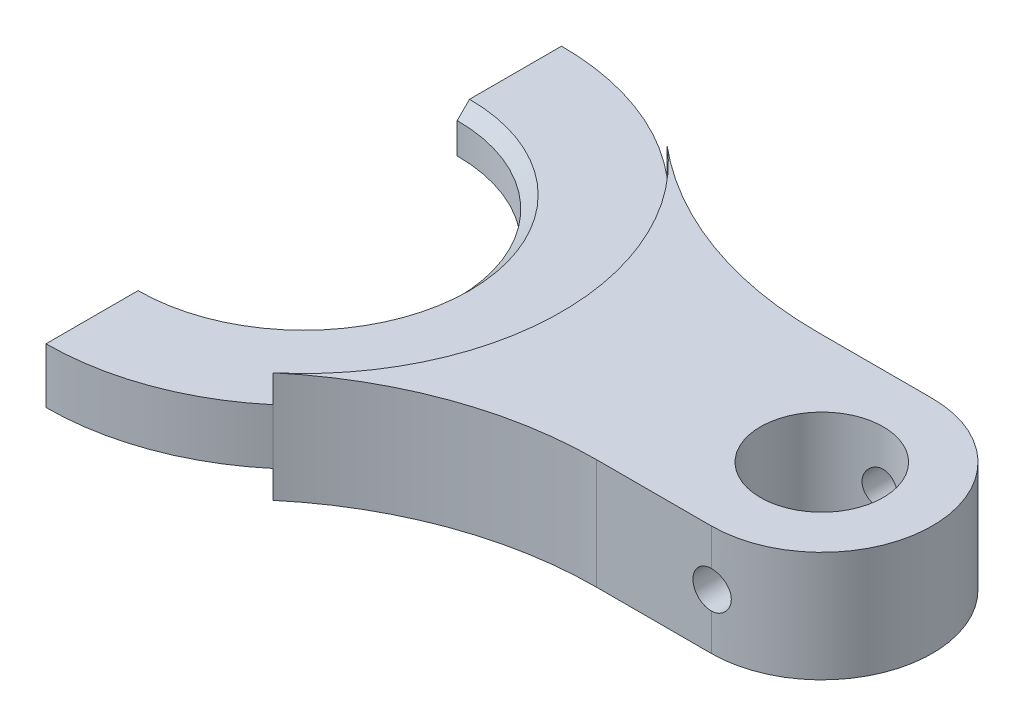
ISO-10303-21;
HEADER;
FILE_DESCRIPTION(('STEP AP214'),'2;1');
FILE_NAME('part.step','',(''),(''),'','','');
FILE_SCHEMA(('AUTOMOTIVE_DESIGN { 1 0 10303 214 1 1 1 1 }'));
ENDSEC;
DATA;
#1=APPLICATION_CONTEXT('core data for automotive mechanical design processes');
#2=APPLICATION_PROTOCOL_DEFINITION('international standard','automotive_design',2000,#1);
#3=PRODUCT_CONTEXT('',#1,'mechanical');
#4=PRODUCT('Part','Part','',(#3));
#5=PRODUCT_RELATED_PRODUCT_CATEGORY('part','',(#4));
#6=PRODUCT_DEFINITION_FORMATION('','',#4);
#7=PRODUCT_DEFINITION_CONTEXT('part definition',#1,'design');
#8=PRODUCT_DEFINITION('design','',#6,#7);
#9=PRODUCT_DEFINITION_SHAPE('','',#8);
#10=(LENGTH_UNIT() NAMED_UNIT(*) SI_UNIT(.MILLI.,.METRE.));
#11=(NAMED_UNIT(*) PLANE_ANGLE_UNIT() SI_UNIT($,.RADIAN.));
#12=(NAMED_UNIT(*) SI_UNIT($,.STERADIAN.) SOLID_ANGLE_UNIT());
#13=UNCERTAINTY_MEASURE_WITH_UNIT(LENGTH_MEASURE(1.E-05),#10,'distance_accuracy_value','');
#14=(GEOMETRIC_REPRESENTATION_CONTEXT(3) GLOBAL_UNCERTAINTY_ASSIGNED_CONTEXT((#13)) GLOBAL_UNIT_ASSIGNED_CONTEXT((#10,
#11,#12)) REPRESENTATION_CONTEXT('',''));
#15=CARTESIAN_POINT('',(0.,0.,0.));
#16=DIRECTION('',(0.,0.,1.));
#17=DIRECTION('',(1.,0.,0.));
#18=AXIS2_PLACEMENT_3D('',#15,#16,#17);
#19=CARTESIAN_POINT('',(-42.2,4.5,0.));
#20=DIRECTION('',(0.,-1.,0.));
#21=DIRECTION('',(0.,0.,-1.));
#22=AXIS2_PLACEMENT_3D('',#19,#20,#21);
#23=CYLINDRICAL_SURFACE('',#22,21.);
#24=CARTESIAN_POINT('',(-42.2,-2.25,0.));
#25=DIRECTION('',(0.,1.,0.));
#26=DIRECTION('',(0.,0.,1.));
#27=AXIS2_PLACEMENT_3D('',#24,#25,#26);
#28=CIRCLE('',#27,21.);
#29=CARTESIAN_POINT('',(-28.6680309322253,-2.25,-16.0588235294118));
#30=VERTEX_POINT('',#29);
#31=CARTESIAN_POINT('',(-42.2000000000001,-2.25,-21.));
#32=VERTEX_POINT('',#31);
#33=EDGE_CURVE('E375',#30,#32,#28,.T.);
#34=ORIENTED_EDGE('',*,*,#33,.T.);
#35=DIRECTION('',(0.,-1.,0.));
#36=VECTOR('',#35,1.);
#37=CARTESIAN_POINT('',(-42.2000000000001,4.5,-21.));
#38=LINE('',#37,#36);
#39=CARTESIAN_POINT('',(-42.2000000000001,2.25,-21.));
#40=VERTEX_POINT('',#39);
#41=EDGE_CURVE('E204',#40,#32,#38,.T.);
#42=ORIENTED_EDGE('',*,*,#41,.F.);
#43=CARTESIAN_POINT('',(-42.2,2.25,0.));
#44=DIRECTION('',(0.,1.,0.));
#45=DIRECTION('',(0.,0.,1.));
#46=AXIS2_PLACEMENT_3D('',#43,#44,#45);
#47=CIRCLE('',#46,21.);
#48=CARTESIAN_POINT('',(-28.6680309322253,2.25,-16.0588235294118));
#49=VERTEX_POINT('',#48);
#50=EDGE_CURVE('E323',#49,#40,#47,.T.);
#51=ORIENTED_EDGE('',*,*,#50,.F.);
#52=DIRECTION('',(0.,-1.,0.));
#53=VECTOR('',#52,1.);
#54=CARTESIAN_POINT('',(-28.6680309322253,4.5,-16.0588235294118));
#55=LINE('',#54,#53);
#56=EDGE_CURVE('E207',#49,#30,#55,.T.);
#57=ORIENTED_EDGE('',*,*,#56,.T.);
#58=EDGE_LOOP('',(#34,#42,#51,#57));
#59=FACE_BOUND('',#58,.T.);
#60=ADVANCED_FACE('F41',(#59),#23,.T.);
#61=CARTESIAN_POINT('',(-42.2000000000001,4.5,-21.));
#62=DIRECTION('',(1.,0.,0.));
#63=DIRECTION('',(0.,0.,-1.));
#64=AXIS2_PLACEMENT_3D('',#61,#62,#63);
#65=PLANE('',#64);
#66=DIRECTION('',(0.,0.,1.));
#67=VECTOR('',#66,1.);
#68=CARTESIAN_POINT('',(-42.2000000000001,-2.25,-21.));
#69=LINE('',#68,#67);
#70=CARTESIAN_POINT('',(-42.2,-2.25,-13.5));
#71=VERTEX_POINT('',#70);
#72=EDGE_CURVE('E310',#32,#71,#69,.T.);
#73=ORIENTED_EDGE('',*,*,#72,.T.);
#74=DIRECTION('',(0.,0.707106781186543,0.707106781186552));
#75=VECTOR('',#74,1.);
#76=CARTESIAN_POINT('',(-42.1999999999999,11.2499999999998,0.));
#77=LINE('',#76,#75);
#78=CARTESIAN_POINT('',(-42.2,-1.25,-12.5));
#79=VERTEX_POINT('',#78);
#80=EDGE_CURVE('E56',#71,#79,#77,.T.);
#81=ORIENTED_EDGE('',*,*,#80,.T.);
#82=DIRECTION('',(0.,-1.,0.));
#83=VECTOR('',#82,1.);
#84=CARTESIAN_POINT('',(-42.2,4.5,-12.5));
#85=LINE('',#84,#83);
#86=CARTESIAN_POINT('',(-42.2,1.24999999999999,-12.5));
#87=VERTEX_POINT('',#86);
#88=EDGE_CURVE('E201',#87,#79,#85,.T.);
#89=ORIENTED_EDGE('',*,*,#88,.F.);
#90=DIRECTION('',(0.,0.707106781186549,-0.707106781186546));
#91=VECTOR('',#90,1.);
#92=CARTESIAN_POINT('',(-42.1999999999999,-11.2500000000001,0.));
#93=LINE('',#92,#91);
#94=CARTESIAN_POINT('',(-42.2,2.25,-13.5));
#95=VERTEX_POINT('',#94);
#96=EDGE_CURVE('E221',#87,#95,#93,.T.);
#97=ORIENTED_EDGE('',*,*,#96,.T.);
#98=DIRECTION('',(0.,0.,1.));
#99=VECTOR('',#98,1.);
#100=CARTESIAN_POINT('',(-42.2000000000001,2.25,-21.));
#101=LINE('',#100,#99);
#102=EDGE_CURVE('E316',#40,#95,#101,.T.);
#103=ORIENTED_EDGE('',*,*,#102,.F.);
#104=ORIENTED_EDGE('',*,*,#41,.T.);
#105=EDGE_LOOP('',(#73,#81,#89,#97,#103,#104));
#106=FACE_BOUND('',#105,.T.);
#107=ADVANCED_FACE('F280',(#106),#65,.F.);
#108=CARTESIAN_POINT('',(-42.2,4.5,0.));
#109=DIRECTION('',(0.,-1.,0.));
#110=DIRECTION('',(0.,0.,-1.));
#111=AXIS2_PLACEMENT_3D('',#108,#109,#110);
#112=CYLINDRICAL_SURFACE('',#111,12.5);
#113=ORIENTED_EDGE('',*,*,#88,.T.);
#114=CARTESIAN_POINT('',(-42.2,-1.25,0.));
#115=DIRECTION('',(0.,-1.,0.));
#116=DIRECTION('',(0.,0.,-1.));
#117=AXIS2_PLACEMENT_3D('',#114,#115,#116);
#118=CIRCLE('',#117,12.5);
#119=CARTESIAN_POINT('',(-42.1999999999998,-1.25,12.5));
#120=VERTEX_POINT('',#119);
#121=EDGE_CURVE('E212',#79,#120,#118,.T.);
#122=ORIENTED_EDGE('',*,*,#121,.T.);
#123=DIRECTION('',(0.,-1.,0.));
#124=VECTOR('',#123,1.);
#125=CARTESIAN_POINT('',(-42.1999999999998,4.5,12.5));
#126=LINE('',#125,#124);
#127=CARTESIAN_POINT('',(-42.1999999999998,1.24999999999999,12.5));
#128=VERTEX_POINT('',#127);
#129=EDGE_CURVE('E198',#128,#120,#126,.T.);
#130=ORIENTED_EDGE('',*,*,#129,.F.);
#131=CARTESIAN_POINT('',(-42.2,1.24999999999999,0.));
#132=DIRECTION('',(0.,1.,0.));
#133=DIRECTION('',(0.,0.,1.));
#134=AXIS2_PLACEMENT_3D('',#131,#132,#133);
#135=CIRCLE('',#134,12.5);
#136=EDGE_CURVE('E210',#128,#87,#135,.T.);
#137=ORIENTED_EDGE('',*,*,#136,.T.);
#138=EDGE_LOOP('',(#113,#122,#130,#137));
#139=FACE_BOUND('',#138,.T.);
#140=ADVANCED_FACE('F276',(#139),#112,.F.);
#141=CARTESIAN_POINT('',(-42.1999999999998,4.5,12.5));
#142=DIRECTION('',(1.,0.,0.));
#143=DIRECTION('',(0.,0.,-1.));
#144=AXIS2_PLACEMENT_3D('',#141,#142,#143);
#145=PLANE('',#144);
#146=ORIENTED_EDGE('',*,*,#129,.T.);
#147=DIRECTION('',(0.,-0.707106781186543,0.707106781186552));
#148=VECTOR('',#147,1.);
#149=CARTESIAN_POINT('',(-42.1999999999999,11.2499999999998,0.));
#150=LINE('',#149,#148);
#151=CARTESIAN_POINT('',(-42.1999999999998,-2.25,13.5));
#152=VERTEX_POINT('',#151);
#153=EDGE_CURVE('E217',#120,#152,#150,.T.);
#154=ORIENTED_EDGE('',*,*,#153,.T.);
#155=DIRECTION('',(0.,0.,1.));
#156=VECTOR('',#155,1.);
#157=CARTESIAN_POINT('',(-42.1999999999998,-2.25,12.5));
#158=LINE('',#157,#156);
#159=CARTESIAN_POINT('',(-42.1999999999998,-2.25,21.));
#160=VERTEX_POINT('',#159);
#161=EDGE_CURVE('E384',#152,#160,#158,.T.);
#162=ORIENTED_EDGE('',*,*,#161,.T.);
#163=DIRECTION('',(0.,-1.,0.));
#164=VECTOR('',#163,1.);
#165=CARTESIAN_POINT('',(-42.1999999999998,4.5,21.));
#166=LINE('',#165,#164);
#167=CARTESIAN_POINT('',(-42.1999999999998,2.25,21.));
#168=VERTEX_POINT('',#167);
#169=EDGE_CURVE('E194',#168,#160,#166,.T.);
#170=ORIENTED_EDGE('',*,*,#169,.F.);
#171=DIRECTION('',(0.,0.,1.));
#172=VECTOR('',#171,1.);
#173=CARTESIAN_POINT('',(-42.1999999999998,2.25,12.5));
#174=LINE('',#173,#172);
#175=CARTESIAN_POINT('',(-42.1999999999998,2.25,13.5));
#176=VERTEX_POINT('',#175);
#177=EDGE_CURVE('E324',#176,#168,#174,.T.);
#178=ORIENTED_EDGE('',*,*,#177,.F.);
#179=DIRECTION('',(0.,-0.707106781186549,-0.707106781186546));
#180=VECTOR('',#179,1.);
#181=CARTESIAN_POINT('',(-42.1999999999999,-11.2500000000001,0.));
#182=LINE('',#181,#180);
#183=EDGE_CURVE('E215',#176,#128,#182,.T.);
#184=ORIENTED_EDGE('',*,*,#183,.T.);
#185=EDGE_LOOP('',(#146,#154,#162,#170,#178,#184));
#186=FACE_BOUND('',#185,.T.);
#187=ADVANCED_FACE('F272',(#186),#145,.F.);
#188=CARTESIAN_POINT('',(-42.2,4.5,0.));
#189=DIRECTION('',(0.,-1.,0.));
#190=DIRECTION('',(0.,0.,-1.));
#191=AXIS2_PLACEMENT_3D('',#188,#189,#190);
#192=CYLINDRICAL_SURFACE('',#191,21.);
#193=CARTESIAN_POINT('',(-28.6680309322253,-2.25,16.0588235294118));
#194=VERTEX_POINT('',#193);
#195=EDGE_CURVE('E380',#160,#194,#28,.T.);
#196=ORIENTED_EDGE('',*,*,#195,.T.);
#197=DIRECTION('',(0.,-1.,0.));
#198=VECTOR('',#197,1.);
#199=CARTESIAN_POINT('',(-28.6680309322253,4.5,16.0588235294118));
#200=LINE('',#199,#198);
#201=CARTESIAN_POINT('',(-28.6680309322253,2.25,16.0588235294118));
#202=VERTEX_POINT('',#201);
#203=EDGE_CURVE('E195',#202,#194,#200,.T.);
#204=ORIENTED_EDGE('',*,*,#203,.F.);
#205=EDGE_CURVE('E325',#168,#202,#47,.T.);
#206=ORIENTED_EDGE('',*,*,#205,.F.);
#207=ORIENTED_EDGE('',*,*,#169,.T.);
#208=EDGE_LOOP('',(#196,#204,#206,#207));
#209=FACE_BOUND('',#208,.T.);
#210=ADVANCED_FACE('F268',(#209),#192,.T.);
#211=CARTESIAN_POINT('',(-9.33664654969003,-4.5,-39.));
#212=DIRECTION('',(0.,-1.,0.));
#213=DIRECTION('',(0.,0.,-1.));
#214=AXIS2_PLACEMENT_3D('',#211,#212,#213);
#215=PLANE('',#214);
#216=CARTESIAN_POINT('',(0.,-4.5,0.));
#217=DIRECTION('',(0.,1.,0.));
#218=DIRECTION('',(0.,0.,1.));
#219=AXIS2_PLACEMENT_3D('',#216,#217,#218);
#220=CIRCLE('',#219,5.);
#221=CARTESIAN_POINT('',(0.,-4.5,5.));
#222=VERTEX_POINT('',#221);
#223=EDGE_CURVE('E327',#222,#222,#220,.T.);
#224=ORIENTED_EDGE('',*,*,#223,.T.);
#225=EDGE_LOOP('',(#224));
#226=FACE_BOUND('',#225,.T.);
#227=CARTESIAN_POINT('',(-9.33664654969003,-4.5,39.));
#228=DIRECTION('',(0.,-1.,0.));
#229=DIRECTION('',(0.,0.,1.));
#230=AXIS2_PLACEMENT_3D('',#227,#228,#229);
#231=CIRCLE('',#230,30.);
#232=CARTESIAN_POINT('',(-28.6680309322253,-4.5,16.0588235294118));
#233=VERTEX_POINT('',#232);
#234=CARTESIAN_POINT('',(-9.33664654969003,-4.5,9.));
#235=VERTEX_POINT('',#234);
#236=EDGE_CURVE('E355',#233,#235,#231,.T.);
#237=ORIENTED_EDGE('',*,*,#236,.F.);
#238=CARTESIAN_POINT('',(-42.2,-4.5,0.));
#239=DIRECTION('',(0.,1.,0.));
#240=DIRECTION('',(0.,0.,1.));
#241=AXIS2_PLACEMENT_3D('',#238,#239,#240);
#242=CIRCLE('',#241,21.);
#243=CARTESIAN_POINT('',(-28.6680309322253,-4.5,-16.0588235294118));
#244=VERTEX_POINT('',#243);
#245=EDGE_CURVE('E371',#233,#244,#242,.T.);
#246=ORIENTED_EDGE('',*,*,#245,.T.);
#247=CARTESIAN_POINT('',(-9.33664654969003,-4.5,-39.));
#248=DIRECTION('',(0.,-1.,0.));
#249=DIRECTION('',(0.,0.,-1.));
#250=AXIS2_PLACEMENT_3D('',#247,#248,#249);
#251=CIRCLE('',#250,30.);
#252=CARTESIAN_POINT('',(-9.33664654969002,-4.5,-9.));
#253=VERTEX_POINT('',#252);
#254=EDGE_CURVE('E339',#253,#244,#251,.T.);
#255=ORIENTED_EDGE('',*,*,#254,.F.);
#256=DIRECTION('',(-1.,0.,0.));
#257=VECTOR('',#256,1.);
#258=CARTESIAN_POINT('',(0.,-4.5,-9.));
#259=LINE('',#258,#257);
#260=CARTESIAN_POINT('',(0.,-4.5,-9.));
#261=VERTEX_POINT('',#260);
#262=EDGE_CURVE('E346',#261,#253,#259,.T.);
#263=ORIENTED_EDGE('',*,*,#262,.F.);
#264=CARTESIAN_POINT('',(0.,-4.5,0.));
#265=DIRECTION('',(0.,1.,0.));
#266=DIRECTION('',(0.,0.,1.));
#267=AXIS2_PLACEMENT_3D('',#264,#265,#266);
#268=CIRCLE('',#267,9.);
#269=CARTESIAN_POINT('',(0.,-4.5,9.));
#270=VERTEX_POINT('',#269);
#271=EDGE_CURVE('E360',#270,#261,#268,.T.);
#272=ORIENTED_EDGE('',*,*,#271,.F.);
#273=DIRECTION('',(1.,0.,0.));
#274=VECTOR('',#273,1.);
#275=CARTESIAN_POINT('',(0.,-4.5,9.));
#276=LINE('',#275,#274);
#277=EDGE_CURVE('E357',#235,#270,#276,.T.);
#278=ORIENTED_EDGE('',*,*,#277,.F.);
#279=EDGE_LOOP('',(#237,#246,#255,#263,#272,#278));
#280=FACE_BOUND('',#279,.T.);
#281=ADVANCED_FACE('F271',(#226,#280),#215,.T.);
#282=CARTESIAN_POINT('',(-9.33664654969003,4.5,-39.));
#283=DIRECTION('',(0.,-1.,0.));
#284=DIRECTION('',(0.,0.,-1.));
#285=AXIS2_PLACEMENT_3D('',#282,#283,#284);
#286=PLANE('',#285);
#287=CARTESIAN_POINT('',(-9.33664654969003,4.5,-39.));
#288=DIRECTION('',(0.,-1.,0.));
#289=DIRECTION('',(0.,0.,-1.));
#290=AXIS2_PLACEMENT_3D('',#287,#288,#289);
#291=CIRCLE('',#290,30.);
#292=CARTESIAN_POINT('',(-9.33664654969002,4.5,-9.));
#293=VERTEX_POINT('',#292);
#294=CARTESIAN_POINT('',(-28.6680309322253,4.5,-16.0588235294118));
#295=VERTEX_POINT('',#294);
#296=EDGE_CURVE('E342',#293,#295,#291,.T.);
#297=ORIENTED_EDGE('',*,*,#296,.T.);
#298=CARTESIAN_POINT('',(-42.2,4.5,0.));
#299=DIRECTION('',(0.,1.,0.));
#300=DIRECTION('',(0.,0.,1.));
#301=AXIS2_PLACEMENT_3D('',#298,#299,#300);
#302=CIRCLE('',#301,21.);
#303=CARTESIAN_POINT('',(-28.6680309322253,4.5,16.0588235294118));
#304=VERTEX_POINT('',#303);
#305=EDGE_CURVE('E333',#304,#295,#302,.T.);
#306=ORIENTED_EDGE('',*,*,#305,.F.);
#307=CARTESIAN_POINT('',(-9.33664654969003,4.5,39.));
#308=DIRECTION('',(0.,-1.,0.));
#309=DIRECTION('',(0.,0.,1.));
#310=AXIS2_PLACEMENT_3D('',#307,#308,#309);
#311=CIRCLE('',#310,30.);
#312=CARTESIAN_POINT('',(-9.33664654969003,4.5,9.));
#313=VERTEX_POINT('',#312);
#314=EDGE_CURVE('E345',#304,#313,#311,.T.);
#315=ORIENTED_EDGE('',*,*,#314,.T.);
#316=DIRECTION('',(1.,0.,0.));
#317=VECTOR('',#316,1.);
#318=CARTESIAN_POINT('',(0.,4.5,9.));
#319=LINE('',#318,#317);
#320=CARTESIAN_POINT('',(0.,4.5,9.));
#321=VERTEX_POINT('',#320);
#322=EDGE_CURVE('E348',#313,#321,#319,.T.);
#323=ORIENTED_EDGE('',*,*,#322,.T.);
#324=CARTESIAN_POINT('',(0.,4.5,0.));
#325=DIRECTION('',(0.,1.,0.));
#326=DIRECTION('',(0.,0.,1.));
#327=AXIS2_PLACEMENT_3D('',#324,#325,#326);
#328=CIRCLE('',#327,9.);
#329=CARTESIAN_POINT('',(0.,4.5,-9.));
#330=VERTEX_POINT('',#329);
#331=EDGE_CURVE('E350',#321,#330,#328,.T.);
#332=ORIENTED_EDGE('',*,*,#331,.T.);
#333=DIRECTION('',(-1.,0.,0.));
#334=VECTOR('',#333,1.);
#335=CARTESIAN_POINT('',(0.,4.5,-9.));
#336=LINE('',#335,#334);
#337=EDGE_CURVE('E178',#330,#293,#336,.T.);
#338=ORIENTED_EDGE('',*,*,#337,.T.);
#339=EDGE_LOOP('',(#297,#306,#315,#323,#332,#338));
#340=FACE_BOUND('',#339,.T.);
#341=CARTESIAN_POINT('',(0.,4.5,0.));
#342=DIRECTION('',(0.,1.,0.));
#343=DIRECTION('',(0.,0.,1.));
#344=AXIS2_PLACEMENT_3D('',#341,#342,#343);
#345=CIRCLE('',#344,5.);
#346=CARTESIAN_POINT('',(0.,4.5,5.));
#347=VERTEX_POINT('',#346);
#348=EDGE_CURVE('E336',#347,#347,#345,.T.);
#349=ORIENTED_EDGE('',*,*,#348,.F.);
#350=EDGE_LOOP('',(#349));
#351=FACE_BOUND('',#350,.T.);
#352=ADVANCED_FACE('F289',(#340,#351),#286,.F.);
#353=CARTESIAN_POINT('',(-9.33664654969003,4.5,-39.));
#354=DIRECTION('',(0.,-1.,0.));
#355=DIRECTION('',(0.,0.,-1.));
#356=AXIS2_PLACEMENT_3D('',#353,#354,#355);
#357=CYLINDRICAL_SURFACE('',#356,30.);
#358=ORIENTED_EDGE('',*,*,#254,.T.);
#359=DIRECTION('',(0.,-1.,0.));
#360=VECTOR('',#359,1.);
#361=CARTESIAN_POINT('',(-28.6680309322253,-3.375,-16.0588235294118));
#362=LINE('',#361,#360);
#363=EDGE_CURVE('E335',#30,#244,#362,.T.);
#364=ORIENTED_EDGE('',*,*,#363,.F.);
#365=ORIENTED_EDGE('',*,*,#56,.F.);
#366=EDGE_CURVE('E208',#295,#49,#55,.T.);
#367=ORIENTED_EDGE('',*,*,#366,.F.);
#368=ORIENTED_EDGE('',*,*,#296,.F.);
#369=DIRECTION('',(0.,-1.,0.));
#370=VECTOR('',#369,1.);
#371=CARTESIAN_POINT('',(-9.33664654969002,4.5,-9.));
#372=LINE('',#371,#370);
#373=EDGE_CURVE('E183',#293,#253,#372,.T.);
#374=ORIENTED_EDGE('',*,*,#373,.T.);
#375=EDGE_LOOP('',(#358,#364,#365,#367,#368,#374));
#376=FACE_BOUND('',#375,.T.);
#377=ADVANCED_FACE('F266',(#376),#357,.F.);
#378=CARTESIAN_POINT('',(-9.33664654969003,4.5,39.));
#379=DIRECTION('',(0.,-1.,0.));
#380=DIRECTION('',(0.,0.,-1.));
#381=AXIS2_PLACEMENT_3D('',#378,#379,#380);
#382=CYLINDRICAL_SURFACE('',#381,30.);
#383=ORIENTED_EDGE('',*,*,#236,.T.);
#384=DIRECTION('',(0.,-1.,0.));
#385=VECTOR('',#384,1.);
#386=CARTESIAN_POINT('',(-9.33664654969003,4.5,9.));
#387=LINE('',#386,#385);
#388=EDGE_CURVE('E187',#313,#235,#387,.T.);
#389=ORIENTED_EDGE('',*,*,#388,.F.);
#390=ORIENTED_EDGE('',*,*,#314,.F.);
#391=EDGE_CURVE('E191',#304,#202,#200,.T.);
#392=ORIENTED_EDGE('',*,*,#391,.T.);
#393=ORIENTED_EDGE('',*,*,#203,.T.);
#394=EDGE_CURVE('E190',#194,#233,#200,.T.);
#395=ORIENTED_EDGE('',*,*,#394,.T.);
#396=EDGE_LOOP('',(#383,#389,#390,#392,#393,#395));
#397=FACE_BOUND('',#396,.T.);
#398=ADVANCED_FACE('F262',(#397),#382,.F.);
#399=CARTESIAN_POINT('',(0.,4.5,9.));
#400=DIRECTION('',(0.,0.,-1.));
#401=DIRECTION('',(-1.,0.,0.));
#402=AXIS2_PLACEMENT_3D('',#399,#400,#401);
#403=PLANE('',#402);
#404=DIRECTION('',(0.,-1.,0.));
#405=VECTOR('',#404,1.);
#406=CARTESIAN_POINT('',(0.,4.5,9.));
#407=LINE('',#406,#405);
#408=CARTESIAN_POINT('',(0.,-1.5,9.));
#409=VERTEX_POINT('',#408);
#410=EDGE_CURVE('E179',#409,#270,#407,.T.);
#411=ORIENTED_EDGE('',*,*,#410,.F.);
#412=CARTESIAN_POINT('',(0.,0.,9.));
#413=DIRECTION('',(0.,0.,-1.));
#414=DIRECTION('',(-1.,0.,0.));
#415=AXIS2_PLACEMENT_3D('',#412,#413,#414);
#416=CIRCLE('',#415,1.5);
#417=CARTESIAN_POINT('',(0.,1.5,9.));
#418=VERTEX_POINT('',#417);
#419=EDGE_CURVE('E63',#409,#418,#416,.T.);
#420=ORIENTED_EDGE('',*,*,#419,.T.);
#421=EDGE_CURVE('E181',#321,#418,#407,.T.);
#422=ORIENTED_EDGE('',*,*,#421,.F.);
#423=ORIENTED_EDGE('',*,*,#322,.F.);
#424=ORIENTED_EDGE('',*,*,#388,.T.);
#425=ORIENTED_EDGE('',*,*,#277,.T.);
#426=EDGE_LOOP('',(#411,#420,#422,#423,#424,#425));
#427=FACE_BOUND('',#426,.T.);
#428=ADVANCED_FACE('F257',(#427),#403,.F.);
#429=CARTESIAN_POINT('',(0.,4.5,0.));
#430=DIRECTION('',(0.,-1.,0.));
#431=DIRECTION('',(0.,0.,-1.));
#432=AXIS2_PLACEMENT_3D('',#429,#430,#431);
#433=CYLINDRICAL_SURFACE('',#432,9.);
#434=ORIENTED_EDGE('',*,*,#421,.T.);
#435=CARTESIAN_POINT('',(0.,1.5,9.));
#436=CARTESIAN_POINT('',(0.0418927263079582,1.50000005796022,9.00000162445344));
#437=CARTESIAN_POINT('',(0.0837651066123643,1.49824388964113,8.99970713379091));
#438=CARTESIAN_POINT('',(0.167204683679198,1.49124003974534,8.99854317464727));
#439=CARTESIAN_POINT('',(0.208771909820702,1.48599269886334,8.99767376227136));
#440=CARTESIAN_POINT('',(0.332454280047606,1.46507477418181,8.99423385609944));
#441=CARTESIAN_POINT('',(0.41373214089735,1.4442280783881,8.99083154727387));
#442=CARTESIAN_POINT('',(0.571572580943043,1.38935174409709,8.9821808494961));
#443=CARTESIAN_POINT('',(0.648134066661824,1.35531906170177,8.97693203431586));
#444=CARTESIAN_POINT('',(0.794472801726528,1.27505836813646,8.96516609985167));
#445=CARTESIAN_POINT('',(0.864250011084276,1.22883028508977,8.95864897309267));
#446=CARTESIAN_POINT('',(0.995681476921034,1.12502939207381,8.94500024489011));
#447=CARTESIAN_POINT('',(1.05726213245379,1.06736404298488,8.93786391757378));
#448=CARTESIAN_POINT('',(1.16992791854434,0.94251766418898,8.92381641993233));
#449=CARTESIAN_POINT('',(1.22101138341222,0.875335127151435,8.9169052854869));
#450=CARTESIAN_POINT('',(1.31152165876118,0.732855361485714,8.9040452100946));
#451=CARTESIAN_POINT('',(1.35087501218466,0.657510865516079,8.8981024340999));
#452=CARTESIAN_POINT('',(1.41633650031927,0.501169610470193,8.88791849407483));
#453=CARTESIAN_POINT('',(1.4424462875294,0.420173558016416,8.88367711776187));
#454=CARTESIAN_POINT('',(1.48044840540713,0.255612815218149,8.8774232584916));
#455=CARTESIAN_POINT('',(1.49246913303096,0.172078554628644,8.87539065903557));
#456=CARTESIAN_POINT('',(1.50235008354229,0.0041538491113888,8.87372362532124));
#457=CARTESIAN_POINT('',(1.50021097156087,-0.080236555414729,8.87408907841905));
#458=CARTESIAN_POINT('',(1.48193703205792,-0.246556982356971,8.8771585780064));
#459=CARTESIAN_POINT('',(1.46594683261536,-0.328503406317083,8.87983845722708));
#460=CARTESIAN_POINT('',(1.42065169127561,-0.488533289255081,8.88719700094536));
#461=CARTESIAN_POINT('',(1.39134637750746,-0.566616640275655,8.89187572126734));
#462=CARTESIAN_POINT('',(1.32010570495632,-0.717138698700256,8.90273097770938));
#463=CARTESIAN_POINT('',(1.27811006663835,-0.789548341565763,8.90891463443355));
#464=CARTESIAN_POINT('',(1.18272512829911,-0.926345053558405,8.92207777066712));
#465=CARTESIAN_POINT('',(1.12933533274673,-0.990731773576226,8.92905728478217));
#466=CARTESIAN_POINT('',(1.0118978029484,-1.11048732598584,8.94313119333016));
#467=CARTESIAN_POINT('',(0.947727319347897,-1.16573579892282,8.95022594647141));
#468=CARTESIAN_POINT('',(0.810940023615719,-1.2647146071032,8.96365384466982));
#469=CARTESIAN_POINT('',(0.738320835071104,-1.30844169031694,8.96998677442103));
#470=CARTESIAN_POINT('',(0.58657441100165,-1.38314754544681,8.98118735423149));
#471=CARTESIAN_POINT('',(0.50743815968146,-1.41410828834264,8.98605292946205));
#472=CARTESIAN_POINT('',(0.345044026677642,-1.46222169582762,8.99374891079569));
#473=CARTESIAN_POINT('',(0.261792481702682,-1.479394928001,8.99658234767456));
#474=CARTESIAN_POINT('',(0.148256696656848,-1.49295310004744,8.99882786961251));
#475=CARTESIAN_POINT('',(0.118642451035981,-1.49559679872788,8.99926705767629));
#476=CARTESIAN_POINT('',(0.0593564534528249,-1.49911794578964,8.99985282091241));
#477=CARTESIAN_POINT('',(0.0296848832979417,-1.49999837203422,8.99999988942086));
#478=CARTESIAN_POINT('',(0.,-1.5,9.));
#479=B_SPLINE_CURVE_WITH_KNOTS('',3,(#435,#436,#437,#438,#439,#440,#441,#442,#443,#444,#445,
#446,#447,#448,#449,#450,#451,#452,#453,#454,#455,#456,#457,#458,#459,#460,#461,#462,#463,#464,
#465,#466,#467,#468,#469,#470,#471,#472,#473,#474,#475,#476,#477,#478),.UNSPECIFIED.,.F.,.F.,(4,
2,2,2,2,2,2,2,2,2,2,2,2,2,2,2,2,2,2,2,2,4),(0.,0.125600095107453,0.251187935016835,
0.501824564236408,0.752519085773248,1.003215084875,1.25602891880484,1.50888283820521,
1.76328844439969,2.01766229868647,2.2696995004474,2.52172486333215,2.77114996218777,
3.0205820275365,3.27121804327242,3.52186496137345,3.77558770422598,4.02938198637471,
4.2835334671431,4.5373051080919,4.62647047739694,4.71548513434778),.UNSPECIFIED.);
#480=EDGE_CURVE('E174',#418,#409,#479,.T.);
#481=ORIENTED_EDGE('',*,*,#480,.T.);
#482=ORIENTED_EDGE('',*,*,#410,.T.);
#483=ORIENTED_EDGE('',*,*,#271,.T.);
#484=DIRECTION('',(0.,-1.,0.));
#485=VECTOR('',#484,1.);
#486=CARTESIAN_POINT('',(0.,4.5,-9.));
#487=LINE('',#486,#485);
#488=CARTESIAN_POINT('',(0.,-1.5,-9.));
#489=VERTEX_POINT('',#488);
#490=EDGE_CURVE('E173',#489,#261,#487,.T.);
#491=ORIENTED_EDGE('',*,*,#490,.F.);
#492=CARTESIAN_POINT('',(0.,-1.5,-9.));
#493=CARTESIAN_POINT('',(0.0418927263079571,-1.50000005796022,-9.00000162445344));
#494=CARTESIAN_POINT('',(0.0837651066123632,-1.49824388964113,-8.99970713379091));
#495=CARTESIAN_POINT('',(0.167204683679197,-1.49124003974534,-8.99854317464727));
#496=CARTESIAN_POINT('',(0.208771909820701,-1.48599269886334,-8.99767376227136));
#497=CARTESIAN_POINT('',(0.332454280047605,-1.46507477418181,-8.99423385609944));
#498=CARTESIAN_POINT('',(0.413732140897349,-1.4442280783881,-8.99083154727387));
#499=CARTESIAN_POINT('',(0.571572580943042,-1.38935174409709,-8.9821808494961));
#500=CARTESIAN_POINT('',(0.648134066661823,-1.35531906170177,-8.97693203431586));
#501=CARTESIAN_POINT('',(0.794472801726527,-1.27505836813646,-8.96516609985167));
#502=CARTESIAN_POINT('',(0.864250011084275,-1.22883028508977,-8.95864897309267));
#503=CARTESIAN_POINT('',(0.995681476921033,-1.12502939207381,-8.94500024489011));
#504=CARTESIAN_POINT('',(1.05726213245379,-1.06736404298488,-8.93786391757378));
#505=CARTESIAN_POINT('',(1.16992791854434,-0.942517664188981,-8.92381641993233));
#506=CARTESIAN_POINT('',(1.22101138341222,-0.875335127151436,-8.9169052854869));
#507=CARTESIAN_POINT('',(1.31152165876118,-0.732855361485714,-8.9040452100946));
#508=CARTESIAN_POINT('',(1.35087501218466,-0.65751086551608,-8.8981024340999));
#509=CARTESIAN_POINT('',(1.41633650031927,-0.501169610470194,-8.88791849407483));
#510=CARTESIAN_POINT('',(1.4424462875294,-0.420173558016417,-8.88367711776187));
#511=CARTESIAN_POINT('',(1.48044840540713,-0.25561281521815,-8.8774232584916));
#512=CARTESIAN_POINT('',(1.49246913303096,-0.172078554628644,-8.87539065903557));
#513=CARTESIAN_POINT('',(1.50235008354229,-0.00415384911138954,-8.87372362532124));
#514=CARTESIAN_POINT('',(1.50021097156087,0.0802365554147283,-8.87408907841905));
#515=CARTESIAN_POINT('',(1.48193703205792,0.246556982356971,-8.8771585780064));
#516=CARTESIAN_POINT('',(1.46594683261536,0.328503406317083,-8.87983845722708));
#517=CARTESIAN_POINT('',(1.42065169127561,0.488533289255081,-8.88719700094536));
#518=CARTESIAN_POINT('',(1.39134637750746,0.566616640275655,-8.89187572126734));
#519=CARTESIAN_POINT('',(1.32010570495632,0.717138698700256,-8.90273097770938));
#520=CARTESIAN_POINT('',(1.27811006663835,0.789548341565762,-8.90891463443355));
#521=CARTESIAN_POINT('',(1.18272512829911,0.926345053558404,-8.92207777066712));
#522=CARTESIAN_POINT('',(1.12933533274673,0.990731773576226,-8.92905728478217));
#523=CARTESIAN_POINT('',(1.0118978029484,1.11048732598584,-8.94313119333016));
#524=CARTESIAN_POINT('',(0.947727319347897,1.16573579892282,-8.95022594647141));
#525=CARTESIAN_POINT('',(0.810940023615719,1.2647146071032,-8.96365384466982));
#526=CARTESIAN_POINT('',(0.738320835071104,1.30844169031694,-8.96998677442103));
#527=CARTESIAN_POINT('',(0.58657441100165,1.38314754544681,-8.98118735423149));
#528=CARTESIAN_POINT('',(0.507438159681461,1.41410828834264,-8.98605292946205));
#529=CARTESIAN_POINT('',(0.345044026677643,1.46222169582762,-8.99374891079569));
#530=CARTESIAN_POINT('',(0.261792481702683,1.479394928001,-8.99658234767456));
#531=CARTESIAN_POINT('',(0.148256696656849,1.49295310004743,-8.99882786961251));
#532=CARTESIAN_POINT('',(0.118642451035982,1.49559679872788,-8.99926705767629));
#533=CARTESIAN_POINT('',(0.0593564534528251,1.49911794578964,-8.99985282091241));
#534=CARTESIAN_POINT('',(0.0296848832979412,1.49999837203422,-8.99999988942086));
#535=CARTESIAN_POINT('',(0.,1.5,-9.));
#536=B_SPLINE_CURVE_WITH_KNOTS('',3,(#492,#493,#494,#495,#496,#497,#498,#499,#500,#501,#502,
#503,#504,#505,#506,#507,#508,#509,#510,#511,#512,#513,#514,#515,#516,#517,#518,#519,#520,#521,
#522,#523,#524,#525,#526,#527,#528,#529,#530,#531,#532,#533,#534,#535),.UNSPECIFIED.,.F.,.F.,(4,
2,2,2,2,2,2,2,2,2,2,2,2,2,2,2,2,2,2,2,2,4),(0.,0.125600095107453,0.251187935016835,
0.501824564236408,0.752519085773248,1.003215084875,1.25602891880484,1.50888283820521,
1.76328844439969,2.01766229868647,2.2696995004474,2.52172486333215,2.77114996218777,
3.0205820275365,3.27121804327242,3.52186496137345,3.77558770422598,4.02938198637471,
4.2835334671431,4.53730510809189,4.62647047739694,4.71548513434778),.UNSPECIFIED.);
#537=CARTESIAN_POINT('',(0.,1.5,-9.));
#538=VERTEX_POINT('',#537);
#539=EDGE_CURVE('E70',#489,#538,#536,.T.);
#540=ORIENTED_EDGE('',*,*,#539,.T.);
#541=EDGE_CURVE('E170',#330,#538,#487,.T.);
#542=ORIENTED_EDGE('',*,*,#541,.F.);
#543=ORIENTED_EDGE('',*,*,#331,.F.);
#544=EDGE_LOOP('',(#434,#481,#482,#483,#491,#540,#542,#543));
#545=FACE_BOUND('',#544,.T.);
#546=ADVANCED_FACE('F168',(#545),#433,.T.);
#547=CARTESIAN_POINT('',(0.,4.5,-9.));
#548=DIRECTION('',(0.,0.,1.));
#549=DIRECTION('',(1.,0.,0.));
#550=AXIS2_PLACEMENT_3D('',#547,#548,#549);
#551=PLANE('',#550);
#552=ORIENTED_EDGE('',*,*,#541,.T.);
#553=CARTESIAN_POINT('',(0.,0.,-9.));
#554=DIRECTION('',(0.,0.,1.));
#555=DIRECTION('',(1.,0.,0.));
#556=AXIS2_PLACEMENT_3D('',#553,#554,#555);
#557=CIRCLE('',#556,1.5);
#558=EDGE_CURVE('E159',#538,#489,#557,.T.);
#559=ORIENTED_EDGE('',*,*,#558,.T.);
#560=ORIENTED_EDGE('',*,*,#490,.T.);
#561=ORIENTED_EDGE('',*,*,#262,.T.);
#562=ORIENTED_EDGE('',*,*,#373,.F.);
#563=ORIENTED_EDGE('',*,*,#337,.F.);
#564=EDGE_LOOP('',(#552,#559,#560,#561,#562,#563));
#565=FACE_BOUND('',#564,.T.);
#566=ADVANCED_FACE('F176',(#565),#551,.F.);
#567=CARTESIAN_POINT('',(0.,4.5,0.));
#568=DIRECTION('',(0.,-1.,0.));
#569=DIRECTION('',(0.,0.,-1.));
#570=AXIS2_PLACEMENT_3D('',#567,#568,#569);
#571=CYLINDRICAL_SURFACE('',#570,5.);
#572=CARTESIAN_POINT('',(0.,1.5,-5.));
#573=CARTESIAN_POINT('',(-0.0822886127533,1.49999900251511,-4.9999992925055));
#574=CARTESIAN_POINT('',(-0.164587318351529,1.49320613637603,-4.99794915693954));
#575=CARTESIAN_POINT('',(-0.326788125304881,1.4662786457779,-4.98997105593691));
#576=CARTESIAN_POINT('',(-0.40668950441142,1.44614004197666,-4.98404193389692));
#577=CARTESIAN_POINT('',(-0.561732707754526,1.39325398308974,-4.96895552501836));
#578=CARTESIAN_POINT('',(-0.636881364395373,1.36052513038106,-4.95980300250425));
#579=CARTESIAN_POINT('',(-0.780624181053131,1.28346390694416,-4.93922109237645));
#580=CARTESIAN_POINT('',(-0.849217467469669,1.23912999260458,-4.92779140192067));
#581=CARTESIAN_POINT('',(-0.979871797183745,1.13877599252733,-4.90350737192774));
#582=CARTESIAN_POINT('',(-1.04171807124434,1.08248337411409,-4.89062383657036));
#583=CARTESIAN_POINT('',(-1.15524920923324,0.960390770089816,-4.86505834210442));
#584=CARTESIAN_POINT('',(-1.20693236327441,0.89458918787504,-4.85237641724501));
#585=CARTESIAN_POINT('',(-1.29980037723708,0.753529246962388,-4.82834113993772));
#586=CARTESIAN_POINT('',(-1.34072309022213,0.678091539009262,-4.81702406663875));
#587=CARTESIAN_POINT('',(-1.4092139477476,0.521010745769707,-4.79743620394031));
#588=CARTESIAN_POINT('',(-1.43678529919973,0.439369156072024,-4.78916468313311));
#589=CARTESIAN_POINT('',(-1.47701633682652,0.27460973386954,-4.77690870838434));
#590=CARTESIAN_POINT('',(-1.49007196234677,0.191597256136057,-4.77281069324533));
#591=CARTESIAN_POINT('',(-1.50213730614672,0.0244668437832342,-4.76902789749767));
#592=CARTESIAN_POINT('',(-1.50115042761078,-0.0596508180590879,-4.76934204760571));
#593=CARTESIAN_POINT('',(-1.48546977199812,-0.223383908608484,-4.77424744067778));
#594=CARTESIAN_POINT('',(-1.47127205262685,-0.303052250362239,-4.7786838859914));
#595=CARTESIAN_POINT('',(-1.43037420427056,-0.458819786273461,-4.79108356228624));
#596=CARTESIAN_POINT('',(-1.40367284141641,-0.534918627374333,-4.79904714132351));
#597=CARTESIAN_POINT('',(-1.33816026653682,-0.68260034966074,-4.81772733074973));
#598=CARTESIAN_POINT('',(-1.29918816934642,-0.754107083955263,-4.82848016115952));
#599=CARTESIAN_POINT('',(-1.21035222588683,-0.889732022010193,-4.85150987000065));
#600=CARTESIAN_POINT('',(-1.16048574002588,-0.953848429413778,-4.86378711746991));
#601=CARTESIAN_POINT('',(-1.04881290765546,-1.07568619076202,-4.88911011297937));
#602=CARTESIAN_POINT('',(-0.986594907466972,-1.13302866402967,-4.90216654310498));
#603=CARTESIAN_POINT('',(-0.853263259313967,-1.23655398406425,-4.92712244063259));
#604=CARTESIAN_POINT('',(-0.782149051860887,-1.28273612841443,-4.9390218351841));
#605=CARTESIAN_POINT('',(-0.632355038342802,-1.36285992246473,-4.9604316006947));
#606=CARTESIAN_POINT('',(-0.553627749747949,-1.39671751624986,-4.96992543668314));
#607=CARTESIAN_POINT('',(-0.391245415603518,-1.45059959009963,-4.98533521832222));
#608=CARTESIAN_POINT('',(-0.307591751589581,-1.47062792853249,-4.99125216186999));
#609=CARTESIAN_POINT('',(-0.140952242668331,-1.49565217789939,-4.99868364643538));
#610=CARTESIAN_POINT('',(-0.0580500976011865,-1.50116158580161,-5.0003485041779));
#611=CARTESIAN_POINT('',(0.107499605823383,-1.49843084428792,-4.9995292324176));
#612=CARTESIAN_POINT('',(0.190147196690781,-1.49019253034856,-4.99704565677756));
#613=CARTESIAN_POINT('',(0.350903605309697,-1.4606153888885,-4.98830696987163));
#614=CARTESIAN_POINT('',(0.429072772614169,-1.43957661241913,-4.98213829799417));
#615=CARTESIAN_POINT('',(0.580754638954522,-1.3853567672218,-4.96674347841533));
#616=CARTESIAN_POINT('',(0.654266777025584,-1.35217423896214,-4.95751696321085));
#617=CARTESIAN_POINT('',(0.796437189461053,-1.27374683451887,-4.93669654351325));
#618=CARTESIAN_POINT('',(0.86494382619967,-1.22824065905203,-4.92505280829675));
#619=CARTESIAN_POINT('',(0.993523307980147,-1.12677524594719,-4.90073468764318));
#620=CARTESIAN_POINT('',(1.05359403235593,-1.07081338811233,-4.8880600443108));
#621=CARTESIAN_POINT('',(1.16585744551027,-0.947612691630654,-4.86253171869138));
#622=CARTESIAN_POINT('',(1.21768481231504,-0.880038124228263,-4.84968825033268));
#623=CARTESIAN_POINT('',(1.30928995072154,-0.736872060986467,-4.82576515238463));
#624=CARTESIAN_POINT('',(1.34906803829472,-0.661280775441786,-4.81468547654651));
#625=CARTESIAN_POINT('',(1.41517347127168,-0.504467508745312,-4.79567189615055));
#626=CARTESIAN_POINT('',(1.4415634693705,-0.423273813463409,-4.78772337843827));
#627=CARTESIAN_POINT('',(1.48021730815114,-0.257312031068522,-4.77591594362794));
#628=CARTESIAN_POINT('',(1.49248598978779,-0.172545179212331,-4.772055625083));
#629=CARTESIAN_POINT('',(1.50221984485059,-0.00563848162377221,-4.76899972496087));
#630=CARTESIAN_POINT('',(1.5002805530849,0.0764636510175858,-4.76961647442754));
#631=CARTESIAN_POINT('',(1.48307505444813,0.2391141033728,-4.77499401288294));
#632=CARTESIAN_POINT('',(1.46780938124716,0.319662485176353,-4.77975463592551));
#633=CARTESIAN_POINT('',(1.42476888804136,0.475945399142852,-4.79275763670386));
#634=CARTESIAN_POINT('',(1.39715175507068,0.551727287361693,-4.80095604545965));
#635=CARTESIAN_POINT('',(1.33031507121129,0.697642438817723,-4.81990278909136));
#636=CARTESIAN_POINT('',(1.29109329962876,0.767774617640757,-4.83065161194312));
#637=CARTESIAN_POINT('',(1.20048763805072,0.903163116527113,-4.85397676425833));
#638=CARTESIAN_POINT('',(1.14871276092994,0.968148761260411,-4.86660540163798));
#639=CARTESIAN_POINT('',(1.03517434629782,1.08870249830786,-4.89201320450026));
#640=CARTESIAN_POINT('',(0.973408217134502,1.14426813946776,-4.90479240823905));
#641=CARTESIAN_POINT('',(0.839465762183249,1.24602341229503,-4.92950936570649));
#642=CARTESIAN_POINT('',(0.767037885790608,1.29189144685549,-4.94141159765674));
#643=CARTESIAN_POINT('',(0.61514137398353,1.37073516990402,-4.96260680455813));
#644=CARTESIAN_POINT('',(0.535676052998955,1.40371688827451,-4.97190099931067));
#645=CARTESIAN_POINT('',(0.380757712655282,1.45289527565275,-4.98602174969301));
#646=CARTESIAN_POINT('',(0.305786961954234,1.47051167288325,-4.99122027381068));
#647=CARTESIAN_POINT('',(0.15388019523078,1.49406352524158,-4.99820944494492));
#648=CARTESIAN_POINT('',(0.0769445098581396,1.50000093270482,-5.0000006615474));
#649=CARTESIAN_POINT('',(0.,1.5,-5.));
#650=B_SPLINE_CURVE_WITH_KNOTS('',3,(#572,#573,#574,#575,#576,#577,#578,#579,#580,#581,#582,
#583,#584,#585,#586,#587,#588,#589,#590,#591,#592,#593,#594,#595,#596,#597,#598,#599,#600,#601,
#602,#603,#604,#605,#606,#607,#608,#609,#610,#611,#612,#613,#614,#615,#616,#617,#618,#619,#620,
#621,#622,#623,#624,#625,#626,#627,#628,#629,#630,#631,#632,#633,#634,#635,#636,#637,#638,#639,
#640,#641,#642,#643,#644,#645,#646,#647,#648,#649),.UNSPECIFIED.,.T.,.F.,(4,2,2,2,2,2,2,2,2,2,2,
2,2,2,2,2,2,2,2,2,2,2,2,2,2,2,2,2,2,2,2,2,2,2,2,2,2,2,4),(0.,0.246583203612611,0.493239964846,
0.739533676300874,0.985860164412702,1.23855602948191,1.49129437288633,1.74971481004109,
2.00807314543224,2.25919689356599,2.51025978319089,2.75226016697676,2.99428443658001,
3.2396242644712,3.48502360158555,3.74067104048167,3.99633456531072,4.25371046881689,
4.51101453528808,4.75908809438545,5.00712853550327,5.24956746682327,5.49203554593729,
5.74011305702908,5.98825282000191,6.24540400322819,6.50254844252681,6.75847814951252,
7.01432009460283,7.25950155466943,7.504673196616,7.74680040402721,7.98897397553107,
8.23996925679931,8.49102974897502,8.74942996156671,9.00770911595235,9.2383169193046,
9.46888616948875),.UNSPECIFIED.);
#651=CARTESIAN_POINT('',(0.,1.5,-5.));
#652=VERTEX_POINT('',#651);
#653=EDGE_CURVE('E46',#652,#652,#650,.T.);
#654=ORIENTED_EDGE('',*,*,#653,.F.);
#655=EDGE_LOOP('',(#654));
#656=FACE_BOUND('',#655,.T.);
#657=CARTESIAN_POINT('',(1.5,0.,4.76969600708473));
#658=CARTESIAN_POINT('',(1.49999897633764,-0.0821945479424036,4.7696968572698));
#659=CARTESIAN_POINT('',(1.49322108167142,-0.164399224144025,4.77184390209069));
#660=CARTESIAN_POINT('',(1.46635844446749,-0.326405249591943,4.780165783029));
#661=CARTESIAN_POINT('',(1.44626925573578,-0.406205786501466,4.78634196493468));
#662=CARTESIAN_POINT('',(1.39352753269955,-0.561034728271731,4.80196102485633));
#663=CARTESIAN_POINT('',(1.36089589394243,-0.636070829633086,4.81139846703232));
#664=CARTESIAN_POINT('',(1.28406421917929,-0.779621933995301,4.83246932547567));
#665=CARTESIAN_POINT('',(1.23986245137053,-0.848135958684439,4.84410307041019));
#666=CARTESIAN_POINT('',(1.13964754141627,-0.978866390577376,4.86866862185765));
#667=CARTESIAN_POINT('',(1.08333207175807,-1.04084589794629,4.88162808311636));
#668=CARTESIAN_POINT('',(0.961136237579598,-1.15463795132251,4.90714861936757));
#669=CARTESIAN_POINT('',(0.895254645461111,-1.20644919044988,4.91970964297705));
#670=CARTESIAN_POINT('',(0.754111437793689,-1.29946269983331,4.94333214579389));
#671=CARTESIAN_POINT('',(0.678684021335814,-1.34042342444281,4.95435724342404));
#672=CARTESIAN_POINT('',(0.521624645369353,-1.40898725904276,4.97334435920684));
#673=CARTESIAN_POINT('',(0.439994028387911,-1.43659324985745,4.98130703789495));
#674=CARTESIAN_POINT('',(0.275323852630829,-1.47688000109051,4.99307646003589));
#675=CARTESIAN_POINT('',(0.1923913989538,-1.4899651276527,4.99699557369338));
#676=CARTESIAN_POINT('',(0.0254218237493141,-1.50211732464644,5.00063201501348));
#677=CARTESIAN_POINT('',(-0.0586150620503691,-1.50118733940196,5.00035022521079));
#678=CARTESIAN_POINT('',(-0.222571156600161,-1.48560713145698,4.99569603817659));
#679=CARTESIAN_POINT('',(-0.302536267641342,-1.47139480619013,4.9914542020526));
#680=CARTESIAN_POINT('',(-0.458889213442527,-1.43036866400571,4.97951522112593));
#681=CARTESIAN_POINT('',(-0.535276821322847,-1.40355404905733,4.97181785750586));
#682=CARTESIAN_POINT('',(-0.683347326351282,-1.33778797658144,4.95365220986963));
#683=CARTESIAN_POINT('',(-0.754965064694478,-1.29869879719273,4.94315269676706));
#684=CARTESIAN_POINT('',(-0.890764673783156,-1.20960214757177,4.92049640648069));
#685=CARTESIAN_POINT('',(-0.954944774872131,-1.15959208703652,4.90833923637778));
#686=CARTESIAN_POINT('',(-1.0766604815298,-1.0478022492484,4.88311550488165));
#687=CARTESIAN_POINT('',(-1.13384458040112,-0.985643080970262,4.87003195321461));
#688=CARTESIAN_POINT('',(-1.23707651539824,-0.852489982109948,4.84483979887497));
#689=CARTESIAN_POINT('',(-1.28312324482853,-0.781495174610769,4.8327312931702));
#690=CARTESIAN_POINT('',(-1.3631399533545,-0.631760530751011,4.81077903197678));
#691=CARTESIAN_POINT('',(-1.39698989237679,-0.552952954137079,4.80095810695957));
#692=CARTESIAN_POINT('',(-1.45083362878413,-0.390392791554455,4.78496392548436));
#693=CARTESIAN_POINT('',(-1.4708319464056,-0.30664182846544,4.7787894791583));
#694=CARTESIAN_POINT('',(-1.49574770282165,-0.139917639260719,4.77104849541241));
#695=CARTESIAN_POINT('',(-1.50119946380212,-0.0570317761060179,4.7693187867044));
#696=CARTESIAN_POINT('',(-1.49835947233062,0.108472900009868,4.77021192441924));
#697=CARTESIAN_POINT('',(-1.4900696437133,0.191091748730849,4.77283416156589));
#698=CARTESIAN_POINT('',(-1.4604576357419,0.351488377970872,4.78197558554912));
#699=CARTESIAN_POINT('',(-1.4394796143128,0.429336164263524,4.78839176507489));
#700=CARTESIAN_POINT('',(-1.3854857774794,0.580401690814918,4.80429141231227));
#701=CARTESIAN_POINT('',(-1.35246810342759,0.653618714140571,4.81377535359073));
#702=CARTESIAN_POINT('',(-1.274318711965,0.795517464072132,4.83505835023047));
#703=CARTESIAN_POINT('',(-1.22888564172729,0.864024720985792,4.84691271069799));
#704=CARTESIAN_POINT('',(-1.12755301600385,0.992638106180805,4.87148205646987));
#705=CARTESIAN_POINT('',(-1.07165095534896,1.05274221761279,4.88419724730003));
#706=CARTESIAN_POINT('',(-0.948455132493598,1.16518040581474,4.90963633548158));
#707=CARTESIAN_POINT('',(-0.880811065857433,1.21713562898698,4.92234245063004));
#708=CARTESIAN_POINT('',(-0.737461784590248,1.30896670102775,4.94584851748651));
#709=CARTESIAN_POINT('',(-0.661756970543942,1.34884314978146,4.95664856384717));
#710=CARTESIAN_POINT('',(-0.50493550470522,1.4150000305683,4.97505970474957));
#711=CARTESIAN_POINT('',(-0.423864622037837,1.44138201615898,4.98269453424966));
#712=CARTESIAN_POINT('',(-0.258169966504586,1.48006091889042,4.99401979596827));
#713=CARTESIAN_POINT('',(-0.173547217354761,1.49236186594842,4.9977113567088));
#714=CARTESIAN_POINT('',(-0.00665215388274139,1.5022230440545,5.00066544081399));
#715=CARTESIAN_POINT('',(0.075585179086208,1.50033269540783,5.00009305111322));
#716=CARTESIAN_POINT('',(0.238519481164405,1.48317836750088,4.99497264465037));
#717=CARTESIAN_POINT('',(0.31921653734653,1.46791514651956,4.99042485330463));
#718=CARTESIAN_POINT('',(0.475935813041359,1.42478833860038,4.97791168358327));
#719=CARTESIAN_POINT('',(0.551998927351393,1.39706181935099,4.96998352900866));
#720=CARTESIAN_POINT('',(0.698433237752054,1.32991808549281,4.9515294303945));
#721=CARTESIAN_POINT('',(0.768803496050581,1.29049894971381,4.94100305949946));
#722=CARTESIAN_POINT('',(0.904301892420565,1.19962654256996,4.91803965828228));
#723=CARTESIAN_POINT('',(0.969190250076769,1.14782856999923,4.90555226923559));
#724=CARTESIAN_POINT('',(1.08953757134595,1.0342896116672,4.88023537212334));
#725=CARTESIAN_POINT('',(1.14499380960194,0.972545762101847,4.86740576641079));
#726=CARTESIAN_POINT('',(1.24656269394549,0.838659221689491,4.84240680631319));
#727=CARTESIAN_POINT('',(1.29234759757956,0.766261446609561,4.83026852693485));
#728=CARTESIAN_POINT('',(1.37104313528776,0.614444825838978,4.80852547508793));
#729=CARTESIAN_POINT('',(1.40395995557289,0.535029376398803,4.79891948596955));
#730=CARTESIAN_POINT('',(1.4530194253295,0.380259568393725,4.78427816717595));
#731=CARTESIAN_POINT('',(1.47058859011232,0.305391353069007,4.7788615484052));
#732=CARTESIAN_POINT('',(1.49407818835144,0.153684777504227,4.77157042597167));
#733=CARTESIAN_POINT('',(1.50000095706095,0.0768468153547522,4.7696952122143));
#734=CARTESIAN_POINT('',(1.5,0.,4.76969600708473));
#735=B_SPLINE_CURVE_WITH_KNOTS('',3,(#657,#658,#659,#660,#661,#662,#663,#664,#665,#666,#667,
#668,#669,#670,#671,#672,#673,#674,#675,#676,#677,#678,#679,#680,#681,#682,#683,#684,#685,#686,
#687,#688,#689,#690,#691,#692,#693,#694,#695,#696,#697,#698,#699,#700,#701,#702,#703,#704,#705,
#706,#707,#708,#709,#710,#711,#712,#713,#714,#715,#716,#717,#718,#719,#720,#721,#722,#723,#724,
#725,#726,#727,#728,#729,#730,#731,#732,#733,#734),.UNSPECIFIED.,.T.,.F.,(4,2,2,2,2,2,2,2,2,2,2,
2,2,2,2,2,2,2,2,2,2,2,2,2,2,2,2,2,2,2,2,2,2,2,2,2,2,2,4),(0.,0.246300165915543,0.492682641689,
0.738656414466194,0.984667025370102,1.23773150007984,1.49082847871273,1.74915939273645,
2.00743455587877,2.25832140149558,2.5091555410144,2.7520012599088,2.99486235890376,
3.24055209335676,3.48630016590831,3.74152147023278,3.99676812491863,4.25446238246266,
4.51207250628411,4.76008080790309,5.00805439107388,5.24958594938817,5.49115481045788,
5.73920731809389,5.98731925928923,6.24479506100602,6.50225807324202,6.75775391814325,
7.01317662321682,7.2587630391122,7.50433553047755,7.74727096872219,7.99024634491378,
8.24099627054489,8.4918185262989,8.75011639669147,9.00828993963944,9.23861153857448,
9.4688869503356),.UNSPECIFIED.);
#736=CARTESIAN_POINT('',(1.5,0.,4.76969600708473));
#737=VERTEX_POINT('',#736);
#738=EDGE_CURVE('E223',#737,#737,#735,.T.);
#739=ORIENTED_EDGE('',*,*,#738,.F.);
#740=EDGE_LOOP('',(#739));
#741=FACE_BOUND('',#740,.T.);
#742=ORIENTED_EDGE('',*,*,#348,.T.);
#743=EDGE_LOOP('',(#742));
#744=FACE_BOUND('',#743,.T.);
#745=ORIENTED_EDGE('',*,*,#223,.F.);
#746=EDGE_LOOP('',(#745));
#747=FACE_BOUND('',#746,.T.);
#748=ADVANCED_FACE('F228',(#656,#741,#744,#747),#571,.F.);
#749=CARTESIAN_POINT('',(-42.2,2.25,0.));
#750=DIRECTION('',(0.,1.,0.));
#751=DIRECTION('',(0.,0.,1.));
#752=AXIS2_PLACEMENT_3D('',#749,#750,#751);
#753=CYLINDRICAL_SURFACE('',#752,21.);
#754=EDGE_CURVE('E329',#202,#49,#47,.T.);
#755=ORIENTED_EDGE('',*,*,#754,.F.);
#756=ORIENTED_EDGE('',*,*,#391,.F.);
#757=ORIENTED_EDGE('',*,*,#305,.T.);
#758=ORIENTED_EDGE('',*,*,#366,.T.);
#759=EDGE_LOOP('',(#755,#756,#757,#758));
#760=FACE_BOUND('',#759,.T.);
#761=ADVANCED_FACE('F397',(#760),#753,.F.);
#762=CARTESIAN_POINT('',(-42.2,2.25,0.));
#763=DIRECTION('',(0.,1.,0.));
#764=DIRECTION('',(0.,0.,1.));
#765=AXIS2_PLACEMENT_3D('',#762,#763,#764);
#766=PLANE('',#765);
#767=ORIENTED_EDGE('',*,*,#102,.T.);
#768=CARTESIAN_POINT('',(-42.2,2.25,0.));
#769=DIRECTION('',(0.,1.,0.));
#770=DIRECTION('',(0.,0.,1.));
#771=AXIS2_PLACEMENT_3D('',#768,#769,#770);
#772=CIRCLE('',#771,13.5);
#773=EDGE_CURVE('E11',#95,#176,#772,.F.);
#774=ORIENTED_EDGE('',*,*,#773,.T.);
#775=ORIENTED_EDGE('',*,*,#177,.T.);
#776=ORIENTED_EDGE('',*,*,#205,.T.);
#777=ORIENTED_EDGE('',*,*,#754,.T.);
#778=ORIENTED_EDGE('',*,*,#50,.T.);
#779=EDGE_LOOP('',(#767,#774,#775,#776,#777,#778));
#780=FACE_BOUND('',#779,.T.);
#781=ADVANCED_FACE('F319',(#780),#766,.T.);
#782=CARTESIAN_POINT('',(-42.2,-2.25,0.));
#783=DIRECTION('',(0.,-1.,0.));
#784=DIRECTION('',(0.,0.,-1.));
#785=AXIS2_PLACEMENT_3D('',#782,#783,#784);
#786=CYLINDRICAL_SURFACE('',#785,21.);
#787=ORIENTED_EDGE('',*,*,#363,.T.);
#788=ORIENTED_EDGE('',*,*,#245,.F.);
#789=ORIENTED_EDGE('',*,*,#394,.F.);
#790=EDGE_CURVE('E378',#194,#30,#28,.T.);
#791=ORIENTED_EDGE('',*,*,#790,.T.);
#792=EDGE_LOOP('',(#787,#788,#789,#791));
#793=FACE_BOUND('',#792,.T.);
#794=ADVANCED_FACE('F302',(#793),#786,.F.);
#795=CARTESIAN_POINT('',(-42.2,-2.25,0.));
#796=DIRECTION('',(0.,-1.,0.));
#797=DIRECTION('',(0.,0.,1.));
#798=AXIS2_PLACEMENT_3D('',#795,#796,#797);
#799=PLANE('',#798);
#800=ORIENTED_EDGE('',*,*,#161,.F.);
#801=CARTESIAN_POINT('',(-42.2,-2.25,0.));
#802=DIRECTION('',(0.,-1.,0.));
#803=DIRECTION('',(0.,0.,-1.));
#804=AXIS2_PLACEMENT_3D('',#801,#802,#803);
#805=CIRCLE('',#804,13.5);
#806=EDGE_CURVE('E219',#152,#71,#805,.F.);
#807=ORIENTED_EDGE('',*,*,#806,.T.);
#808=ORIENTED_EDGE('',*,*,#72,.F.);
#809=ORIENTED_EDGE('',*,*,#33,.F.);
#810=ORIENTED_EDGE('',*,*,#790,.F.);
#811=ORIENTED_EDGE('',*,*,#195,.F.);
#812=EDGE_LOOP('',(#800,#807,#808,#809,#810,#811));
#813=FACE_BOUND('',#812,.T.);
#814=ADVANCED_FACE('F237',(#813),#799,.T.);
#815=CARTESIAN_POINT('',(-42.2,-1.25,0.));
#816=DIRECTION('',(0.,-1.,0.));
#817=DIRECTION('',(0.,0.,-1.));
#818=AXIS2_PLACEMENT_3D('',#815,#816,#817);
#819=CONICAL_SURFACE('',#818,12.5,0.785398163397455);
#820=ORIENTED_EDGE('',*,*,#80,.F.);
#821=ORIENTED_EDGE('',*,*,#806,.F.);
#822=ORIENTED_EDGE('',*,*,#153,.F.);
#823=ORIENTED_EDGE('',*,*,#121,.F.);
#824=EDGE_LOOP('',(#820,#821,#822,#823));
#825=FACE_BOUND('',#824,.T.);
#826=ADVANCED_FACE('F292',(#825),#819,.F.);
#827=CARTESIAN_POINT('',(-42.2,2.25,0.));
#828=DIRECTION('',(0.,1.,0.));
#829=DIRECTION('',(0.,0.,1.));
#830=AXIS2_PLACEMENT_3D('',#827,#828,#829);
#831=CONICAL_SURFACE('',#830,13.5,0.785398163397446);
#832=ORIENTED_EDGE('',*,*,#96,.F.);
#833=ORIENTED_EDGE('',*,*,#136,.F.);
#834=ORIENTED_EDGE('',*,*,#183,.F.);
#835=ORIENTED_EDGE('',*,*,#773,.F.);
#836=EDGE_LOOP('',(#832,#833,#834,#835));
#837=FACE_BOUND('',#836,.T.);
#838=ADVANCED_FACE('F44',(#837),#831,.F.);
#839=CARTESIAN_POINT('',(0.,0.,-16.625));
#840=DIRECTION('',(0.,0.,1.));
#841=DIRECTION('',(1.,0.,0.));
#842=AXIS2_PLACEMENT_3D('',#839,#840,#841);
#843=CYLINDRICAL_SURFACE('',#842,1.5);
#844=ORIENTED_EDGE('',*,*,#738,.T.);
#845=EDGE_LOOP('',(#844));
#846=FACE_BOUND('',#845,.T.);
#847=ORIENTED_EDGE('',*,*,#480,.F.);
#848=ORIENTED_EDGE('',*,*,#419,.F.);
#849=EDGE_LOOP('',(#847,#848));
#850=FACE_BOUND('',#849,.T.);
#851=ADVANCED_FACE('F232',(#846,#850),#843,.F.);
#852=ORIENTED_EDGE('',*,*,#653,.T.);
#853=EDGE_LOOP('',(#852));
#854=FACE_BOUND('',#853,.T.);
#855=ORIENTED_EDGE('',*,*,#558,.F.);
#856=ORIENTED_EDGE('',*,*,#539,.F.);
#857=EDGE_LOOP('',(#855,#856));
#858=FACE_BOUND('',#857,.T.);
#859=ADVANCED_FACE('F160',(#854,#858),#843,.F.);
#860=CLOSED_SHELL('',(#60,#107,#140,#187,#210,#281,#352,#377,#398,#428,#546,#566,#748,#761,#781,
#794,#814,#826,#838,#851,#859));
#861=MANIFOLD_SOLID_BREP('B2',#860);
#862=ADVANCED_BREP_SHAPE_REPRESENTATION('',(#18,#861),#14);
#863=SHAPE_DEFINITION_REPRESENTATION(#9,#862);
ENDSEC;
END-ISO-10303-21;
